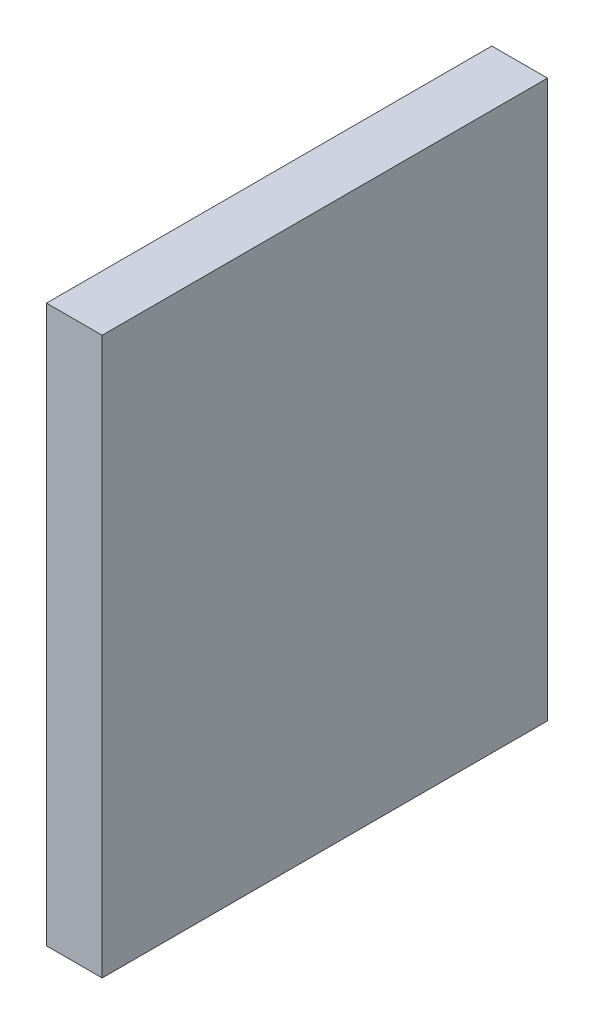
ISO-10303-21;
HEADER;
FILE_DESCRIPTION(('STEP AP214'),'2;1');
FILE_NAME('part.step','',(''),(''),'','','');
FILE_SCHEMA(('AUTOMOTIVE_DESIGN { 1 0 10303 214 1 1 1 1 }'));
ENDSEC;
DATA;
#1=APPLICATION_CONTEXT('core data for automotive mechanical design processes');
#2=APPLICATION_PROTOCOL_DEFINITION('international standard','automotive_design',2000,#1);
#3=PRODUCT_CONTEXT('',#1,'mechanical');
#4=PRODUCT('Part','Part','',(#3));
#5=PRODUCT_RELATED_PRODUCT_CATEGORY('part','',(#4));
#6=PRODUCT_DEFINITION_FORMATION('','',#4);
#7=PRODUCT_DEFINITION_CONTEXT('part definition',#1,'design');
#8=PRODUCT_DEFINITION('design','',#6,#7);
#9=PRODUCT_DEFINITION_SHAPE('','',#8);
#10=(LENGTH_UNIT() NAMED_UNIT(*) SI_UNIT(.MILLI.,.METRE.));
#11=(NAMED_UNIT(*) PLANE_ANGLE_UNIT() SI_UNIT($,.RADIAN.));
#12=(NAMED_UNIT(*) SI_UNIT($,.STERADIAN.) SOLID_ANGLE_UNIT());
#13=UNCERTAINTY_MEASURE_WITH_UNIT(LENGTH_MEASURE(1.E-05),#10,'distance_accuracy_value','');
#14=(GEOMETRIC_REPRESENTATION_CONTEXT(3) GLOBAL_UNCERTAINTY_ASSIGNED_CONTEXT((#13)) GLOBAL_UNIT_ASSIGNED_CONTEXT((#10,
#11,#12)) REPRESENTATION_CONTEXT('',''));
#15=CARTESIAN_POINT('',(0.,0.,0.));
#16=DIRECTION('',(0.,0.,1.));
#17=DIRECTION('',(1.,0.,0.));
#18=AXIS2_PLACEMENT_3D('',#15,#16,#17);
#19=CARTESIAN_POINT('',(0.,127.,0.));
#20=DIRECTION('',(1.,0.,0.));
#21=DIRECTION('',(0.,0.,-1.));
#22=AXIS2_PLACEMENT_3D('',#19,#20,#21);
#23=PLANE('',#22);
#24=DIRECTION('',(0.,0.,1.));
#25=VECTOR('',#24,1.);
#26=CARTESIAN_POINT('',(0.,0.,0.));
#27=LINE('',#26,#25);
#28=CARTESIAN_POINT('',(0.,0.,-101.6));
#29=VERTEX_POINT('',#28);
#30=CARTESIAN_POINT('',(0.,0.,0.));
#31=VERTEX_POINT('',#30);
#32=EDGE_CURVE('E107',#29,#31,#27,.T.);
#33=ORIENTED_EDGE('',*,*,#32,.T.);
#34=DIRECTION('',(0.,-1.,0.));
#35=VECTOR('',#34,1.);
#36=CARTESIAN_POINT('',(0.,127.,0.));
#37=LINE('',#36,#35);
#38=CARTESIAN_POINT('',(0.,127.,0.));
#39=VERTEX_POINT('',#38);
#40=EDGE_CURVE('E11',#39,#31,#37,.T.);
#41=ORIENTED_EDGE('',*,*,#40,.F.);
#42=DIRECTION('',(0.,0.,1.));
#43=VECTOR('',#42,1.);
#44=CARTESIAN_POINT('',(0.,127.,0.));
#45=LINE('',#44,#43);
#46=CARTESIAN_POINT('',(0.,127.,-101.6));
#47=VERTEX_POINT('',#46);
#48=EDGE_CURVE('E91',#47,#39,#45,.T.);
#49=ORIENTED_EDGE('',*,*,#48,.F.);
#50=DIRECTION('',(0.,-1.,0.));
#51=VECTOR('',#50,1.);
#52=CARTESIAN_POINT('',(0.,127.,-101.6));
#53=LINE('',#52,#51);
#54=EDGE_CURVE('E103',#47,#29,#53,.T.);
#55=ORIENTED_EDGE('',*,*,#54,.T.);
#56=EDGE_LOOP('',(#33,#41,#49,#55));
#57=FACE_BOUND('',#56,.T.);
#58=ADVANCED_FACE('F39',(#57),#23,.F.);
#59=CARTESIAN_POINT('',(0.,127.,0.));
#60=DIRECTION('',(0.,0.,-1.));
#61=DIRECTION('',(-1.,0.,0.));
#62=AXIS2_PLACEMENT_3D('',#59,#60,#61);
#63=PLANE('',#62);
#64=DIRECTION('',(1.,0.,0.));
#65=VECTOR('',#64,1.);
#66=CARTESIAN_POINT('',(0.,0.,0.));
#67=LINE('',#66,#65);
#68=CARTESIAN_POINT('',(12.7,0.,0.));
#69=VERTEX_POINT('',#68);
#70=EDGE_CURVE('E96',#31,#69,#67,.T.);
#71=ORIENTED_EDGE('',*,*,#70,.T.);
#72=DIRECTION('',(0.,-1.,0.));
#73=VECTOR('',#72,1.);
#74=CARTESIAN_POINT('',(12.7,127.,0.));
#75=LINE('',#74,#73);
#76=CARTESIAN_POINT('',(12.7,127.,0.));
#77=VERTEX_POINT('',#76);
#78=EDGE_CURVE('E48',#77,#69,#75,.T.);
#79=ORIENTED_EDGE('',*,*,#78,.F.);
#80=DIRECTION('',(1.,0.,0.));
#81=VECTOR('',#80,1.);
#82=CARTESIAN_POINT('',(0.,127.,0.));
#83=LINE('',#82,#81);
#84=EDGE_CURVE('E86',#39,#77,#83,.T.);
#85=ORIENTED_EDGE('',*,*,#84,.F.);
#86=ORIENTED_EDGE('',*,*,#40,.T.);
#87=EDGE_LOOP('',(#71,#79,#85,#86));
#88=FACE_BOUND('',#87,.T.);
#89=ADVANCED_FACE('F95',(#88),#63,.F.);
#90=CARTESIAN_POINT('',(12.7,127.,0.));
#91=DIRECTION('',(-1.,0.,0.));
#92=DIRECTION('',(0.,0.,1.));
#93=AXIS2_PLACEMENT_3D('',#90,#91,#92);
#94=PLANE('',#93);
#95=DIRECTION('',(0.,0.,-1.));
#96=VECTOR('',#95,1.);
#97=CARTESIAN_POINT('',(12.7,0.,0.));
#98=LINE('',#97,#96);
#99=CARTESIAN_POINT('',(12.7,0.,-101.6));
#100=VERTEX_POINT('',#99);
#101=EDGE_CURVE('E73',#69,#100,#98,.T.);
#102=ORIENTED_EDGE('',*,*,#101,.T.);
#103=DIRECTION('',(0.,-1.,0.));
#104=VECTOR('',#103,1.);
#105=CARTESIAN_POINT('',(12.7,127.,-101.6));
#106=LINE('',#105,#104);
#107=CARTESIAN_POINT('',(12.7,127.,-101.6));
#108=VERTEX_POINT('',#107);
#109=EDGE_CURVE('E98',#108,#100,#106,.T.);
#110=ORIENTED_EDGE('',*,*,#109,.F.);
#111=DIRECTION('',(0.,0.,-1.));
#112=VECTOR('',#111,1.);
#113=CARTESIAN_POINT('',(12.7,127.,0.));
#114=LINE('',#113,#112);
#115=EDGE_CURVE('E89',#77,#108,#114,.T.);
#116=ORIENTED_EDGE('',*,*,#115,.F.);
#117=ORIENTED_EDGE('',*,*,#78,.T.);
#118=EDGE_LOOP('',(#102,#110,#116,#117));
#119=FACE_BOUND('',#118,.T.);
#120=ADVANCED_FACE('F99',(#119),#94,.F.);
#121=CARTESIAN_POINT('',(0.,127.,-101.6));
#122=DIRECTION('',(0.,0.,1.));
#123=DIRECTION('',(1.,0.,0.));
#124=AXIS2_PLACEMENT_3D('',#121,#122,#123);
#125=PLANE('',#124);
#126=DIRECTION('',(-1.,0.,0.));
#127=VECTOR('',#126,1.);
#128=CARTESIAN_POINT('',(0.,0.,-101.6));
#129=LINE('',#128,#127);
#130=EDGE_CURVE('E79',#100,#29,#129,.T.);
#131=ORIENTED_EDGE('',*,*,#130,.T.);
#132=ORIENTED_EDGE('',*,*,#54,.F.);
#133=DIRECTION('',(-1.,0.,0.));
#134=VECTOR('',#133,1.);
#135=CARTESIAN_POINT('',(0.,127.,-101.6));
#136=LINE('',#135,#134);
#137=EDGE_CURVE('E56',#108,#47,#136,.T.);
#138=ORIENTED_EDGE('',*,*,#137,.F.);
#139=ORIENTED_EDGE('',*,*,#109,.T.);
#140=EDGE_LOOP('',(#131,#132,#138,#139));
#141=FACE_BOUND('',#140,.T.);
#142=ADVANCED_FACE('F120',(#141),#125,.F.);
#143=CARTESIAN_POINT('',(0.,127.,0.));
#144=DIRECTION('',(0.,-1.,0.));
#145=DIRECTION('',(0.,0.,-1.));
#146=AXIS2_PLACEMENT_3D('',#143,#144,#145);
#147=PLANE('',#146);
#148=ORIENTED_EDGE('',*,*,#48,.T.);
#149=ORIENTED_EDGE('',*,*,#84,.T.);
#150=ORIENTED_EDGE('',*,*,#115,.T.);
#151=ORIENTED_EDGE('',*,*,#137,.T.);
#152=EDGE_LOOP('',(#148,#149,#150,#151));
#153=FACE_BOUND('',#152,.T.);
#154=ADVANCED_FACE('F87',(#153),#147,.F.);
#155=CARTESIAN_POINT('',(0.,0.,0.));
#156=DIRECTION('',(0.,-1.,0.));
#157=DIRECTION('',(0.,0.,-1.));
#158=AXIS2_PLACEMENT_3D('',#155,#156,#157);
#159=PLANE('',#158);
#160=ORIENTED_EDGE('',*,*,#32,.F.);
#161=ORIENTED_EDGE('',*,*,#130,.F.);
#162=ORIENTED_EDGE('',*,*,#101,.F.);
#163=ORIENTED_EDGE('',*,*,#70,.F.);
#164=EDGE_LOOP('',(#160,#161,#162,#163));
#165=FACE_BOUND('',#164,.T.);
#166=ADVANCED_FACE('F123',(#165),#159,.T.);
#167=CLOSED_SHELL('',(#58,#89,#120,#142,#154,#166));
#168=MANIFOLD_SOLID_BREP('B2',#167);
#169=ADVANCED_BREP_SHAPE_REPRESENTATION('',(#18,#168),#14);
#170=SHAPE_DEFINITION_REPRESENTATION(#9,#169);
ENDSEC;
END-ISO-10303-21;
